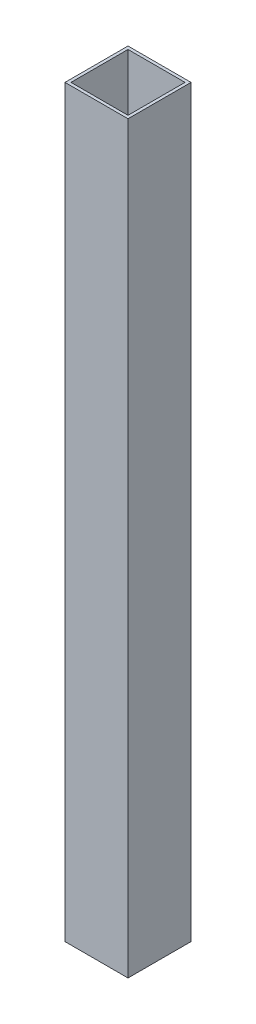
ISO-10303-21;
HEADER;
FILE_DESCRIPTION(('STEP AP214'),'2;1');
FILE_NAME('part.step','',(''),(''),'','','');
FILE_SCHEMA(('AUTOMOTIVE_DESIGN { 1 0 10303 214 1 1 1 1 }'));
ENDSEC;
DATA;
#1=APPLICATION_CONTEXT('core data for automotive mechanical design processes');
#2=APPLICATION_PROTOCOL_DEFINITION('international standard','automotive_design',2000,#1);
#3=PRODUCT_CONTEXT('',#1,'mechanical');
#4=PRODUCT('Part','Part','',(#3));
#5=PRODUCT_RELATED_PRODUCT_CATEGORY('part','',(#4));
#6=PRODUCT_DEFINITION_FORMATION('','',#4);
#7=PRODUCT_DEFINITION_CONTEXT('part definition',#1,'design');
#8=PRODUCT_DEFINITION('design','',#6,#7);
#9=PRODUCT_DEFINITION_SHAPE('','',#8);
#10=(LENGTH_UNIT() NAMED_UNIT(*) SI_UNIT(.MILLI.,.METRE.));
#11=(NAMED_UNIT(*) PLANE_ANGLE_UNIT() SI_UNIT($,.RADIAN.));
#12=(NAMED_UNIT(*) SI_UNIT($,.STERADIAN.) SOLID_ANGLE_UNIT());
#13=UNCERTAINTY_MEASURE_WITH_UNIT(LENGTH_MEASURE(1.E-05),#10,'distance_accuracy_value','');
#14=(GEOMETRIC_REPRESENTATION_CONTEXT(3) GLOBAL_UNCERTAINTY_ASSIGNED_CONTEXT((#13)) GLOBAL_UNIT_ASSIGNED_CONTEXT((#10,
#11,#12)) REPRESENTATION_CONTEXT('',''));
#15=CARTESIAN_POINT('',(0.,0.,0.));
#16=DIRECTION('',(0.,0.,1.));
#17=DIRECTION('',(1.,0.,0.));
#18=AXIS2_PLACEMENT_3D('',#15,#16,#17);
#19=CARTESIAN_POINT('',(0.,150.,0.));
#20=DIRECTION('',(0.,-1.,0.));
#21=DIRECTION('',(0.,0.,-1.));
#22=AXIS2_PLACEMENT_3D('',#19,#20,#21);
#23=PLANE('',#22);
#24=DIRECTION('',(0.,0.,-1.));
#25=VECTOR('',#24,1.);
#26=CARTESIAN_POINT('',(12.7,150.,12.7));
#27=LINE('',#26,#25);
#28=CARTESIAN_POINT('',(12.7,150.,12.7));
#29=VERTEX_POINT('',#28);
#30=CARTESIAN_POINT('',(12.7,150.,-12.7));
#31=VERTEX_POINT('',#30);
#32=EDGE_CURVE('E138',#29,#31,#27,.T.);
#33=ORIENTED_EDGE('',*,*,#32,.T.);
#34=DIRECTION('',(-1.,0.,0.));
#35=VECTOR('',#34,1.);
#36=CARTESIAN_POINT('',(-12.7,150.,-12.7));
#37=LINE('',#36,#35);
#38=CARTESIAN_POINT('',(-12.7,150.,-12.7));
#39=VERTEX_POINT('',#38);
#40=EDGE_CURVE('E141',#31,#39,#37,.T.);
#41=ORIENTED_EDGE('',*,*,#40,.T.);
#42=DIRECTION('',(0.,0.,1.));
#43=VECTOR('',#42,1.);
#44=CARTESIAN_POINT('',(-12.7,150.,12.7));
#45=LINE('',#44,#43);
#46=CARTESIAN_POINT('',(-12.7,150.,12.7));
#47=VERTEX_POINT('',#46);
#48=EDGE_CURVE('E144',#39,#47,#45,.T.);
#49=ORIENTED_EDGE('',*,*,#48,.T.);
#50=DIRECTION('',(1.,0.,0.));
#51=VECTOR('',#50,1.);
#52=CARTESIAN_POINT('',(-12.7,150.,12.7));
#53=LINE('',#52,#51);
#54=EDGE_CURVE('E146',#47,#29,#53,.T.);
#55=ORIENTED_EDGE('',*,*,#54,.T.);
#56=EDGE_LOOP('',(#33,#41,#49,#55));
#57=FACE_BOUND('',#56,.T.);
#58=DIRECTION('',(0.,0.,1.));
#59=VECTOR('',#58,1.);
#60=CARTESIAN_POINT('',(-11.5,150.,11.5));
#61=LINE('',#60,#59);
#62=CARTESIAN_POINT('',(-11.5,150.,-11.5));
#63=VERTEX_POINT('',#62);
#64=CARTESIAN_POINT('',(-11.5,150.,11.5));
#65=VERTEX_POINT('',#64);
#66=EDGE_CURVE('E102',#63,#65,#61,.T.);
#67=ORIENTED_EDGE('',*,*,#66,.F.);
#68=DIRECTION('',(-1.,0.,0.));
#69=VECTOR('',#68,1.);
#70=CARTESIAN_POINT('',(-11.5,150.,-11.5));
#71=LINE('',#70,#69);
#72=CARTESIAN_POINT('',(11.5,150.,-11.5));
#73=VERTEX_POINT('',#72);
#74=EDGE_CURVE('E124',#73,#63,#71,.T.);
#75=ORIENTED_EDGE('',*,*,#74,.F.);
#76=DIRECTION('',(0.,0.,-1.));
#77=VECTOR('',#76,1.);
#78=CARTESIAN_POINT('',(11.5,150.,11.5));
#79=LINE('',#78,#77);
#80=CARTESIAN_POINT('',(11.5,150.,11.5));
#81=VERTEX_POINT('',#80);
#82=EDGE_CURVE('E122',#81,#73,#79,.T.);
#83=ORIENTED_EDGE('',*,*,#82,.F.);
#84=DIRECTION('',(1.,0.,0.));
#85=VECTOR('',#84,1.);
#86=CARTESIAN_POINT('',(-11.5,150.,11.5));
#87=LINE('',#86,#85);
#88=EDGE_CURVE('E110',#65,#81,#87,.T.);
#89=ORIENTED_EDGE('',*,*,#88,.F.);
#90=EDGE_LOOP('',(#67,#75,#83,#89));
#91=FACE_BOUND('',#90,.T.);
#92=ADVANCED_FACE('F37',(#57,#91),#23,.F.);
#93=CARTESIAN_POINT('',(0.,-150.,0.));
#94=DIRECTION('',(0.,-1.,0.));
#95=DIRECTION('',(0.,0.,-1.));
#96=AXIS2_PLACEMENT_3D('',#93,#94,#95);
#97=PLANE('',#96);
#98=DIRECTION('',(0.,0.,-1.));
#99=VECTOR('',#98,1.);
#100=CARTESIAN_POINT('',(12.7,-150.,12.7));
#101=LINE('',#100,#99);
#102=CARTESIAN_POINT('',(12.7,-150.,12.7));
#103=VERTEX_POINT('',#102);
#104=CARTESIAN_POINT('',(12.7,-150.,-12.7));
#105=VERTEX_POINT('',#104);
#106=EDGE_CURVE('E118',#103,#105,#101,.T.);
#107=ORIENTED_EDGE('',*,*,#106,.F.);
#108=DIRECTION('',(1.,0.,0.));
#109=VECTOR('',#108,1.);
#110=CARTESIAN_POINT('',(-12.7,-150.,12.7));
#111=LINE('',#110,#109);
#112=CARTESIAN_POINT('',(-12.7,-150.,12.7));
#113=VERTEX_POINT('',#112);
#114=EDGE_CURVE('E142',#113,#103,#111,.T.);
#115=ORIENTED_EDGE('',*,*,#114,.F.);
#116=DIRECTION('',(0.,0.,1.));
#117=VECTOR('',#116,1.);
#118=CARTESIAN_POINT('',(-12.7,-150.,12.7));
#119=LINE('',#118,#117);
#120=CARTESIAN_POINT('',(-12.7,-150.,-12.7));
#121=VERTEX_POINT('',#120);
#122=EDGE_CURVE('E153',#121,#113,#119,.T.);
#123=ORIENTED_EDGE('',*,*,#122,.F.);
#124=DIRECTION('',(-1.,0.,0.));
#125=VECTOR('',#124,1.);
#126=CARTESIAN_POINT('',(-12.7,-150.,-12.7));
#127=LINE('',#126,#125);
#128=EDGE_CURVE('E151',#105,#121,#127,.T.);
#129=ORIENTED_EDGE('',*,*,#128,.F.);
#130=EDGE_LOOP('',(#107,#115,#123,#129));
#131=FACE_BOUND('',#130,.T.);
#132=DIRECTION('',(-1.,0.,0.));
#133=VECTOR('',#132,1.);
#134=CARTESIAN_POINT('',(-11.5,-150.,-11.5));
#135=LINE('',#134,#133);
#136=CARTESIAN_POINT('',(11.5,-150.,-11.5));
#137=VERTEX_POINT('',#136);
#138=CARTESIAN_POINT('',(-11.5,-150.,-11.5));
#139=VERTEX_POINT('',#138);
#140=EDGE_CURVE('E111',#137,#139,#135,.T.);
#141=ORIENTED_EDGE('',*,*,#140,.T.);
#142=DIRECTION('',(0.,0.,1.));
#143=VECTOR('',#142,1.);
#144=CARTESIAN_POINT('',(-11.5,-150.,11.5));
#145=LINE('',#144,#143);
#146=CARTESIAN_POINT('',(-11.5,-150.,11.5));
#147=VERTEX_POINT('',#146);
#148=EDGE_CURVE('E60',#139,#147,#145,.T.);
#149=ORIENTED_EDGE('',*,*,#148,.T.);
#150=DIRECTION('',(1.,0.,0.));
#151=VECTOR('',#150,1.);
#152=CARTESIAN_POINT('',(-11.5,-150.,11.5));
#153=LINE('',#152,#151);
#154=CARTESIAN_POINT('',(11.5,-150.,11.5));
#155=VERTEX_POINT('',#154);
#156=EDGE_CURVE('E117',#147,#155,#153,.T.);
#157=ORIENTED_EDGE('',*,*,#156,.T.);
#158=DIRECTION('',(0.,0.,-1.));
#159=VECTOR('',#158,1.);
#160=CARTESIAN_POINT('',(11.5,-150.,11.5));
#161=LINE('',#160,#159);
#162=EDGE_CURVE('E130',#155,#137,#161,.T.);
#163=ORIENTED_EDGE('',*,*,#162,.T.);
#164=EDGE_LOOP('',(#141,#149,#157,#163));
#165=FACE_BOUND('',#164,.T.);
#166=ADVANCED_FACE('F171',(#131,#165),#97,.T.);
#167=CARTESIAN_POINT('',(12.7,150.,12.7));
#168=DIRECTION('',(-1.,0.,0.));
#169=DIRECTION('',(0.,0.,1.));
#170=AXIS2_PLACEMENT_3D('',#167,#168,#169);
#171=PLANE('',#170);
#172=ORIENTED_EDGE('',*,*,#106,.T.);
#173=DIRECTION('',(0.,-1.,0.));
#174=VECTOR('',#173,1.);
#175=CARTESIAN_POINT('',(12.7,150.,-12.7));
#176=LINE('',#175,#174);
#177=EDGE_CURVE('E11',#31,#105,#176,.T.);
#178=ORIENTED_EDGE('',*,*,#177,.F.);
#179=ORIENTED_EDGE('',*,*,#32,.F.);
#180=DIRECTION('',(0.,-1.,0.));
#181=VECTOR('',#180,1.);
#182=CARTESIAN_POINT('',(12.7,150.,12.7));
#183=LINE('',#182,#181);
#184=EDGE_CURVE('E148',#29,#103,#183,.T.);
#185=ORIENTED_EDGE('',*,*,#184,.T.);
#186=EDGE_LOOP('',(#172,#178,#179,#185));
#187=FACE_BOUND('',#186,.T.);
#188=ADVANCED_FACE('F39',(#187),#171,.F.);
#189=CARTESIAN_POINT('',(-12.7,150.,-12.7));
#190=DIRECTION('',(0.,0.,1.));
#191=DIRECTION('',(1.,0.,0.));
#192=AXIS2_PLACEMENT_3D('',#189,#190,#191);
#193=PLANE('',#192);
#194=ORIENTED_EDGE('',*,*,#128,.T.);
#195=DIRECTION('',(0.,-1.,0.));
#196=VECTOR('',#195,1.);
#197=CARTESIAN_POINT('',(-12.7,150.,-12.7));
#198=LINE('',#197,#196);
#199=EDGE_CURVE('E45',#39,#121,#198,.T.);
#200=ORIENTED_EDGE('',*,*,#199,.F.);
#201=ORIENTED_EDGE('',*,*,#40,.F.);
#202=ORIENTED_EDGE('',*,*,#177,.T.);
#203=EDGE_LOOP('',(#194,#200,#201,#202));
#204=FACE_BOUND('',#203,.T.);
#205=ADVANCED_FACE('F181',(#204),#193,.F.);
#206=CARTESIAN_POINT('',(-12.7,150.,12.7));
#207=DIRECTION('',(1.,0.,0.));
#208=DIRECTION('',(0.,0.,-1.));
#209=AXIS2_PLACEMENT_3D('',#206,#207,#208);
#210=PLANE('',#209);
#211=ORIENTED_EDGE('',*,*,#122,.T.);
#212=DIRECTION('',(0.,-1.,0.));
#213=VECTOR('',#212,1.);
#214=CARTESIAN_POINT('',(-12.7,150.,12.7));
#215=LINE('',#214,#213);
#216=EDGE_CURVE('E158',#47,#113,#215,.T.);
#217=ORIENTED_EDGE('',*,*,#216,.F.);
#218=ORIENTED_EDGE('',*,*,#48,.F.);
#219=ORIENTED_EDGE('',*,*,#199,.T.);
#220=EDGE_LOOP('',(#211,#217,#218,#219));
#221=FACE_BOUND('',#220,.T.);
#222=ADVANCED_FACE('F165',(#221),#210,.F.);
#223=CARTESIAN_POINT('',(-12.7,150.,12.7));
#224=DIRECTION('',(0.,0.,-1.));
#225=DIRECTION('',(-1.,0.,0.));
#226=AXIS2_PLACEMENT_3D('',#223,#224,#225);
#227=PLANE('',#226);
#228=ORIENTED_EDGE('',*,*,#114,.T.);
#229=ORIENTED_EDGE('',*,*,#184,.F.);
#230=ORIENTED_EDGE('',*,*,#54,.F.);
#231=ORIENTED_EDGE('',*,*,#216,.T.);
#232=EDGE_LOOP('',(#228,#229,#230,#231));
#233=FACE_BOUND('',#232,.T.);
#234=ADVANCED_FACE('F175',(#233),#227,.F.);
#235=CARTESIAN_POINT('',(-11.5,150.,11.5));
#236=DIRECTION('',(1.,0.,0.));
#237=DIRECTION('',(0.,0.,-1.));
#238=AXIS2_PLACEMENT_3D('',#235,#236,#237);
#239=PLANE('',#238);
#240=ORIENTED_EDGE('',*,*,#148,.F.);
#241=DIRECTION('',(0.,-1.,0.));
#242=VECTOR('',#241,1.);
#243=CARTESIAN_POINT('',(-11.5,150.,-11.5));
#244=LINE('',#243,#242);
#245=EDGE_CURVE('E106',#63,#139,#244,.T.);
#246=ORIENTED_EDGE('',*,*,#245,.F.);
#247=ORIENTED_EDGE('',*,*,#66,.T.);
#248=DIRECTION('',(0.,-1.,0.));
#249=VECTOR('',#248,1.);
#250=CARTESIAN_POINT('',(-11.5,150.,11.5));
#251=LINE('',#250,#249);
#252=EDGE_CURVE('E105',#65,#147,#251,.T.);
#253=ORIENTED_EDGE('',*,*,#252,.T.);
#254=EDGE_LOOP('',(#240,#246,#247,#253));
#255=FACE_BOUND('',#254,.T.);
#256=ADVANCED_FACE('F104',(#255),#239,.T.);
#257=CARTESIAN_POINT('',(-11.5,150.,11.5));
#258=DIRECTION('',(0.,0.,-1.));
#259=DIRECTION('',(-1.,0.,0.));
#260=AXIS2_PLACEMENT_3D('',#257,#258,#259);
#261=PLANE('',#260);
#262=ORIENTED_EDGE('',*,*,#156,.F.);
#263=ORIENTED_EDGE('',*,*,#252,.F.);
#264=ORIENTED_EDGE('',*,*,#88,.T.);
#265=DIRECTION('',(0.,-1.,0.));
#266=VECTOR('',#265,1.);
#267=CARTESIAN_POINT('',(11.5,150.,11.5));
#268=LINE('',#267,#266);
#269=EDGE_CURVE('E119',#81,#155,#268,.T.);
#270=ORIENTED_EDGE('',*,*,#269,.T.);
#271=EDGE_LOOP('',(#262,#263,#264,#270));
#272=FACE_BOUND('',#271,.T.);
#273=ADVANCED_FACE('F114',(#272),#261,.T.);
#274=CARTESIAN_POINT('',(11.5,150.,11.5));
#275=DIRECTION('',(-1.,0.,0.));
#276=DIRECTION('',(0.,0.,1.));
#277=AXIS2_PLACEMENT_3D('',#274,#275,#276);
#278=PLANE('',#277);
#279=ORIENTED_EDGE('',*,*,#162,.F.);
#280=ORIENTED_EDGE('',*,*,#269,.F.);
#281=ORIENTED_EDGE('',*,*,#82,.T.);
#282=DIRECTION('',(0.,-1.,0.));
#283=VECTOR('',#282,1.);
#284=CARTESIAN_POINT('',(11.5,150.,-11.5));
#285=LINE('',#284,#283);
#286=EDGE_CURVE('E52',#73,#137,#285,.T.);
#287=ORIENTED_EDGE('',*,*,#286,.T.);
#288=EDGE_LOOP('',(#279,#280,#281,#287));
#289=FACE_BOUND('',#288,.T.);
#290=ADVANCED_FACE('F204',(#289),#278,.T.);
#291=CARTESIAN_POINT('',(-11.5,150.,-11.5));
#292=DIRECTION('',(0.,0.,1.));
#293=DIRECTION('',(1.,0.,0.));
#294=AXIS2_PLACEMENT_3D('',#291,#292,#293);
#295=PLANE('',#294);
#296=ORIENTED_EDGE('',*,*,#140,.F.);
#297=ORIENTED_EDGE('',*,*,#286,.F.);
#298=ORIENTED_EDGE('',*,*,#74,.T.);
#299=ORIENTED_EDGE('',*,*,#245,.T.);
#300=EDGE_LOOP('',(#296,#297,#298,#299));
#301=FACE_BOUND('',#300,.T.);
#302=ADVANCED_FACE('F208',(#301),#295,.T.);
#303=CLOSED_SHELL('',(#92,#166,#188,#205,#222,#234,#256,#273,#290,#302));
#304=MANIFOLD_SOLID_BREP('B2',#303);
#305=ADVANCED_BREP_SHAPE_REPRESENTATION('',(#18,#304),#14);
#306=SHAPE_DEFINITION_REPRESENTATION(#9,#305);
ENDSEC;
END-ISO-10303-21;
